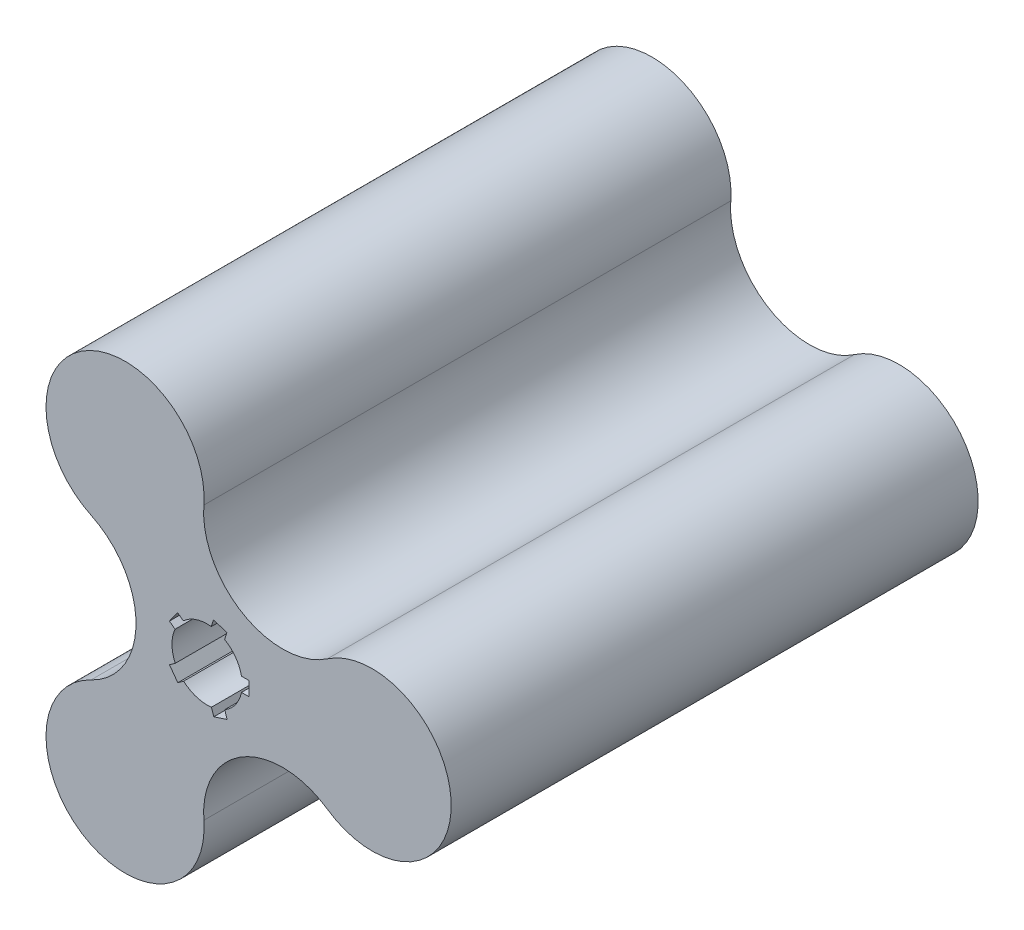
ISO-10303-21;
HEADER;
FILE_DESCRIPTION(('STEP AP214'),'2;1');
FILE_NAME('part.step','',(''),(''),'','','');
FILE_SCHEMA(('AUTOMOTIVE_DESIGN { 1 0 10303 214 1 1 1 1 }'));
ENDSEC;
DATA;
#1=APPLICATION_CONTEXT('core data for automotive mechanical design processes');
#2=APPLICATION_PROTOCOL_DEFINITION('international standard','automotive_design',2000,#1);
#3=PRODUCT_CONTEXT('',#1,'mechanical');
#4=PRODUCT('Part','Part','',(#3));
#5=PRODUCT_RELATED_PRODUCT_CATEGORY('part','',(#4));
#6=PRODUCT_DEFINITION_FORMATION('','',#4);
#7=PRODUCT_DEFINITION_CONTEXT('part definition',#1,'design');
#8=PRODUCT_DEFINITION('design','',#6,#7);
#9=PRODUCT_DEFINITION_SHAPE('','',#8);
#10=(LENGTH_UNIT() NAMED_UNIT(*) SI_UNIT(.MILLI.,.METRE.));
#11=(NAMED_UNIT(*) PLANE_ANGLE_UNIT() SI_UNIT($,.RADIAN.));
#12=(NAMED_UNIT(*) SI_UNIT($,.STERADIAN.) SOLID_ANGLE_UNIT());
#13=UNCERTAINTY_MEASURE_WITH_UNIT(LENGTH_MEASURE(1.E-05),#10,'distance_accuracy_value','');
#14=(GEOMETRIC_REPRESENTATION_CONTEXT(3) GLOBAL_UNCERTAINTY_ASSIGNED_CONTEXT((#13)) GLOBAL_UNIT_ASSIGNED_CONTEXT((#10,
#11,#12)) REPRESENTATION_CONTEXT('',''));
#15=CARTESIAN_POINT('',(0.,0.,0.));
#16=DIRECTION('',(0.,0.,1.));
#17=DIRECTION('',(1.,0.,0.));
#18=AXIS2_PLACEMENT_3D('',#15,#16,#17);
#19=CARTESIAN_POINT('',(0.,0.,75.));
#20=DIRECTION('',(0.,0.,-1.));
#21=DIRECTION('',(-1.,0.,0.));
#22=AXIS2_PLACEMENT_3D('',#19,#20,#21);
#23=CYLINDRICAL_SURFACE('',#22,10.);
#24=CARTESIAN_POINT('',(0.,0.,-75.));
#25=DIRECTION('',(0.,0.,1.));
#26=DIRECTION('',(1.,0.,0.));
#27=AXIS2_PLACEMENT_3D('',#24,#25,#26);
#28=CIRCLE('',#27,10.);
#29=CARTESIAN_POINT('',(9.79795897113271,2.,-75.));
#30=VERTEX_POINT('',#29);
#31=CARTESIAN_POINT('',(4.99493405678501,8.66317688659127,-75.));
#32=VERTEX_POINT('',#31);
#33=EDGE_CURVE('E270',#30,#32,#28,.T.);
#34=ORIENTED_EDGE('',*,*,#33,.F.);
#35=DIRECTION('',(0.,0.,-1.));
#36=VECTOR('',#35,1.);
#37=CARTESIAN_POINT('',(9.79795897113271,2.,75.));
#38=LINE('',#37,#36);
#39=CARTESIAN_POINT('',(9.79795897113271,2.,75.));
#40=VERTEX_POINT('',#39);
#41=EDGE_CURVE('E11',#40,#30,#38,.T.);
#42=ORIENTED_EDGE('',*,*,#41,.F.);
#43=CARTESIAN_POINT('',(0.,0.,75.));
#44=DIRECTION('',(0.,0.,1.));
#45=DIRECTION('',(1.,0.,0.));
#46=AXIS2_PLACEMENT_3D('',#43,#44,#45);
#47=CIRCLE('',#46,10.);
#48=CARTESIAN_POINT('',(4.99493405678501,8.66317688659127,75.));
#49=VERTEX_POINT('',#48);
#50=EDGE_CURVE('E399',#40,#49,#47,.T.);
#51=ORIENTED_EDGE('',*,*,#50,.T.);
#52=DIRECTION('',(0.,0.,-1.));
#53=VECTOR('',#52,1.);
#54=CARTESIAN_POINT('',(4.99493405678501,8.66317688659127,75.));
#55=LINE('',#54,#53);
#56=EDGE_CURVE('E62',#49,#32,#55,.T.);
#57=ORIENTED_EDGE('',*,*,#56,.T.);
#58=EDGE_LOOP('',(#34,#42,#51,#57));
#59=FACE_BOUND('',#58,.T.);
#60=ADVANCED_FACE('F43',(#59),#23,.F.);
#61=CARTESIAN_POINT('',(0.,2.,75.));
#62=DIRECTION('',(0.,1.,0.));
#63=DIRECTION('',(0.,0.,1.));
#64=AXIS2_PLACEMENT_3D('',#61,#62,#63);
#65=PLANE('',#64);
#66=DIRECTION('',(1.,0.,0.));
#67=VECTOR('',#66,1.);
#68=CARTESIAN_POINT('',(0.,2.,-75.));
#69=LINE('',#68,#67);
#70=CARTESIAN_POINT('',(12.,2.,-75.));
#71=VERTEX_POINT('',#70);
#72=EDGE_CURVE('E272',#30,#71,#69,.T.);
#73=ORIENTED_EDGE('',*,*,#72,.T.);
#74=DIRECTION('',(0.,0.,-1.));
#75=VECTOR('',#74,1.);
#76=CARTESIAN_POINT('',(12.,2.,75.));
#77=LINE('',#76,#75);
#78=CARTESIAN_POINT('',(12.,2.,75.));
#79=VERTEX_POINT('',#78);
#80=EDGE_CURVE('E53',#79,#71,#77,.T.);
#81=ORIENTED_EDGE('',*,*,#80,.F.);
#82=DIRECTION('',(1.,0.,0.));
#83=VECTOR('',#82,1.);
#84=CARTESIAN_POINT('',(0.,2.,75.));
#85=LINE('',#84,#83);
#86=EDGE_CURVE('E401',#40,#79,#85,.T.);
#87=ORIENTED_EDGE('',*,*,#86,.F.);
#88=ORIENTED_EDGE('',*,*,#41,.T.);
#89=EDGE_LOOP('',(#73,#81,#87,#88));
#90=FACE_BOUND('',#89,.T.);
#91=ADVANCED_FACE('F509',(#90),#65,.F.);
#92=CARTESIAN_POINT('',(12.,0.,75.));
#93=DIRECTION('',(-1.,0.,0.));
#94=DIRECTION('',(0.,0.,1.));
#95=AXIS2_PLACEMENT_3D('',#92,#93,#94);
#96=PLANE('',#95);
#97=DIRECTION('',(0.,1.,0.));
#98=VECTOR('',#97,1.);
#99=CARTESIAN_POINT('',(12.,0.,-75.));
#100=LINE('',#99,#98);
#101=CARTESIAN_POINT('',(12.,-2.,-75.));
#102=VERTEX_POINT('',#101);
#103=EDGE_CURVE('E277',#102,#71,#100,.T.);
#104=ORIENTED_EDGE('',*,*,#103,.F.);
#105=DIRECTION('',(0.,0.,-1.));
#106=VECTOR('',#105,1.);
#107=CARTESIAN_POINT('',(12.,-2.,75.));
#108=LINE('',#107,#106);
#109=CARTESIAN_POINT('',(12.,-2.,75.));
#110=VERTEX_POINT('',#109);
#111=EDGE_CURVE('E348',#110,#102,#108,.T.);
#112=ORIENTED_EDGE('',*,*,#111,.F.);
#113=DIRECTION('',(0.,1.,0.));
#114=VECTOR('',#113,1.);
#115=CARTESIAN_POINT('',(12.,0.,75.));
#116=LINE('',#115,#114);
#117=EDGE_CURVE('E404',#110,#79,#116,.T.);
#118=ORIENTED_EDGE('',*,*,#117,.T.);
#119=ORIENTED_EDGE('',*,*,#80,.T.);
#120=EDGE_LOOP('',(#104,#112,#118,#119));
#121=FACE_BOUND('',#120,.T.);
#122=ADVANCED_FACE('F513',(#121),#96,.T.);
#123=CARTESIAN_POINT('',(0.,-2.,75.));
#124=DIRECTION('',(0.,1.,0.));
#125=DIRECTION('',(0.,0.,1.));
#126=AXIS2_PLACEMENT_3D('',#123,#124,#125);
#127=PLANE('',#126);
#128=DIRECTION('',(1.,0.,0.));
#129=VECTOR('',#128,1.);
#130=CARTESIAN_POINT('',(0.,-2.,-75.));
#131=LINE('',#130,#129);
#132=CARTESIAN_POINT('',(9.79795897113271,-2.,-75.));
#133=VERTEX_POINT('',#132);
#134=EDGE_CURVE('E280',#133,#102,#131,.T.);
#135=ORIENTED_EDGE('',*,*,#134,.F.);
#136=DIRECTION('',(0.,0.,-1.));
#137=VECTOR('',#136,1.);
#138=CARTESIAN_POINT('',(9.79795897113271,-2.,75.));
#139=LINE('',#138,#137);
#140=CARTESIAN_POINT('',(9.79795897113271,-2.,75.));
#141=VERTEX_POINT('',#140);
#142=EDGE_CURVE('E346',#141,#133,#139,.T.);
#143=ORIENTED_EDGE('',*,*,#142,.F.);
#144=DIRECTION('',(1.,0.,0.));
#145=VECTOR('',#144,1.);
#146=CARTESIAN_POINT('',(0.,-2.,75.));
#147=LINE('',#146,#145);
#148=EDGE_CURVE('E407',#141,#110,#147,.T.);
#149=ORIENTED_EDGE('',*,*,#148,.T.);
#150=ORIENTED_EDGE('',*,*,#111,.T.);
#151=EDGE_LOOP('',(#135,#143,#149,#150));
#152=FACE_BOUND('',#151,.T.);
#153=ADVANCED_FACE('F454',(#152),#127,.T.);
#154=CARTESIAN_POINT('',(5.0350700669273,-8.63991142438004,-75.));
#155=VERTEX_POINT('',#154);
#156=EDGE_CURVE('E274',#155,#133,#28,.T.);
#157=ORIENTED_EDGE('',*,*,#156,.F.);
#158=DIRECTION('',(0.,0.,-1.));
#159=VECTOR('',#158,1.);
#160=CARTESIAN_POINT('',(5.0350700669273,-8.63991142438004,75.));
#161=LINE('',#160,#159);
#162=CARTESIAN_POINT('',(5.0350700669273,-8.63991142438004,75.));
#163=VERTEX_POINT('',#162);
#164=EDGE_CURVE('E344',#163,#155,#161,.T.);
#165=ORIENTED_EDGE('',*,*,#164,.F.);
#166=EDGE_CURVE('E402',#163,#141,#47,.T.);
#167=ORIENTED_EDGE('',*,*,#166,.T.);
#168=ORIENTED_EDGE('',*,*,#142,.T.);
#169=EDGE_LOOP('',(#157,#165,#167,#168));
#170=FACE_BOUND('',#169,.T.);
#171=ADVANCED_FACE('F446',(#170),#23,.F.);
#172=CARTESIAN_POINT('',(2.01505740128812,0.654731838718406,75.));
#173=DIRECTION('',(0.951056516295153,0.309016994374948,0.));
#174=DIRECTION('',(-0.309016994374948,0.951056516295154,0.));
#175=AXIS2_PLACEMENT_3D('',#172,#173,#174);
#176=PLANE('',#175);
#177=DIRECTION('',(0.309016994374948,-0.951056516295154,0.));
#178=VECTOR('',#177,1.);
#179=CARTESIAN_POINT('',(2.01505740128812,0.654731838718406,-75.));
#180=LINE('',#179,#178);
#181=CARTESIAN_POINT('',(5.71133747952332,-10.7212485068549,-75.));
#182=VERTEX_POINT('',#181);
#183=EDGE_CURVE('E283',#155,#182,#180,.T.);
#184=ORIENTED_EDGE('',*,*,#183,.T.);
#185=DIRECTION('',(0.,0.,-1.));
#186=VECTOR('',#185,1.);
#187=CARTESIAN_POINT('',(5.71133747952332,-10.7212485068549,75.));
#188=LINE('',#187,#186);
#189=CARTESIAN_POINT('',(5.71133747952332,-10.7212485068549,75.));
#190=VERTEX_POINT('',#189);
#191=EDGE_CURVE('E342',#190,#182,#188,.T.);
#192=ORIENTED_EDGE('',*,*,#191,.F.);
#193=DIRECTION('',(0.309016994374948,-0.951056516295154,0.));
#194=VECTOR('',#193,1.);
#195=CARTESIAN_POINT('',(2.01505740128812,0.654731838718406,75.));
#196=LINE('',#195,#194);
#197=EDGE_CURVE('E410',#163,#190,#196,.T.);
#198=ORIENTED_EDGE('',*,*,#197,.F.);
#199=ORIENTED_EDGE('',*,*,#164,.T.);
#200=EDGE_LOOP('',(#184,#192,#198,#199));
#201=FACE_BOUND('',#200,.T.);
#202=ADVANCED_FACE('F498',(#201),#176,.F.);
#203=CARTESIAN_POINT('',(3.6962800782352,-11.3759803455733,75.));
#204=DIRECTION('',(-0.309016994374947,0.951056516295154,0.));
#205=DIRECTION('',(-0.951056516295154,-0.309016994374947,0.));
#206=AXIS2_PLACEMENT_3D('',#203,#204,#205);
#207=PLANE('',#206);
#208=DIRECTION('',(0.951056516295154,0.309016994374948,0.));
#209=VECTOR('',#208,1.);
#210=CARTESIAN_POINT('',(3.6962800782352,-11.3759803455733,-75.));
#211=LINE('',#210,#209);
#212=CARTESIAN_POINT('',(1.90711141434271,-11.9573164843547,-75.));
#213=VERTEX_POINT('',#212);
#214=EDGE_CURVE('E286',#213,#182,#211,.T.);
#215=ORIENTED_EDGE('',*,*,#214,.F.);
#216=DIRECTION('',(0.,0.,-1.));
#217=VECTOR('',#216,1.);
#218=CARTESIAN_POINT('',(1.90711141434271,-11.9573164843547,75.));
#219=LINE('',#218,#217);
#220=CARTESIAN_POINT('',(1.90711141434271,-11.9573164843547,75.));
#221=VERTEX_POINT('',#220);
#222=EDGE_CURVE('E340',#221,#213,#219,.T.);
#223=ORIENTED_EDGE('',*,*,#222,.F.);
#224=DIRECTION('',(0.951056516295154,0.309016994374948,0.));
#225=VECTOR('',#224,1.);
#226=CARTESIAN_POINT('',(3.6962800782352,-11.3759803455733,75.));
#227=LINE('',#226,#225);
#228=EDGE_CURVE('E412',#221,#190,#227,.T.);
#229=ORIENTED_EDGE('',*,*,#228,.T.);
#230=ORIENTED_EDGE('',*,*,#191,.T.);
#231=EDGE_LOOP('',(#215,#223,#229,#230));
#232=FACE_BOUND('',#231,.T.);
#233=ADVANCED_FACE('F496',(#232),#207,.T.);
#234=CARTESIAN_POINT('',(-1.78916866389251,-0.581336138781391,75.));
#235=DIRECTION('',(0.951056516295153,0.309016994374949,0.));
#236=DIRECTION('',(-0.309016994374949,0.951056516295153,0.));
#237=AXIS2_PLACEMENT_3D('',#234,#235,#236);
#238=PLANE('',#237);
#239=DIRECTION('',(0.309016994374949,-0.951056516295153,0.));
#240=VECTOR('',#239,1.);
#241=CARTESIAN_POINT('',(-1.78916866389251,-0.581336138781391,-75.));
#242=LINE('',#241,#240);
#243=CARTESIAN_POINT('',(1.24582698272701,-9.92209227578082,-75.));
#244=VERTEX_POINT('',#243);
#245=EDGE_CURVE('E289',#244,#213,#242,.T.);
#246=ORIENTED_EDGE('',*,*,#245,.F.);
#247=DIRECTION('',(0.,0.,-1.));
#248=VECTOR('',#247,1.);
#249=CARTESIAN_POINT('',(1.24582698272701,-9.92209227578082,75.));
#250=LINE('',#249,#248);
#251=CARTESIAN_POINT('',(1.24582698272701,-9.92209227578082,75.));
#252=VERTEX_POINT('',#251);
#253=EDGE_CURVE('E338',#252,#244,#250,.T.);
#254=ORIENTED_EDGE('',*,*,#253,.F.);
#255=DIRECTION('',(0.309016994374949,-0.951056516295153,0.));
#256=VECTOR('',#255,1.);
#257=CARTESIAN_POINT('',(-1.78916866389251,-0.581336138781391,75.));
#258=LINE('',#257,#256);
#259=EDGE_CURVE('E415',#252,#221,#258,.T.);
#260=ORIENTED_EDGE('',*,*,#259,.T.);
#261=ORIENTED_EDGE('',*,*,#222,.T.);
#262=EDGE_LOOP('',(#246,#254,#260,#261));
#263=FACE_BOUND('',#262,.T.);
#264=ADVANCED_FACE('F493',(#263),#238,.T.);
#265=CARTESIAN_POINT('',(-6.66112184182044,-7.45851565718157,-75.));
#266=VERTEX_POINT('',#265);
#267=EDGE_CURVE('E292',#266,#244,#28,.T.);
#268=ORIENTED_EDGE('',*,*,#267,.F.);
#269=DIRECTION('',(0.,0.,-1.));
#270=VECTOR('',#269,1.);
#271=CARTESIAN_POINT('',(-6.66112184182044,-7.45851565718157,75.));
#272=LINE('',#271,#270);
#273=CARTESIAN_POINT('',(-6.66112184182044,-7.45851565718157,75.));
#274=VERTEX_POINT('',#273);
#275=EDGE_CURVE('E336',#274,#266,#272,.T.);
#276=ORIENTED_EDGE('',*,*,#275,.F.);
#277=EDGE_CURVE('E418',#274,#252,#47,.T.);
#278=ORIENTED_EDGE('',*,*,#277,.T.);
#279=ORIENTED_EDGE('',*,*,#253,.T.);
#280=EDGE_LOOP('',(#268,#276,#278,#279));
#281=FACE_BOUND('',#280,.T.);
#282=ADVANCED_FACE('F489',(#281),#23,.F.);
#283=CARTESIAN_POINT('',(1.24537396327809,-1.7141102072815,75.));
#284=DIRECTION('',(0.587785252292473,-0.809016994374948,0.));
#285=DIRECTION('',(0.809016994374948,0.587785252292473,0.));
#286=AXIS2_PLACEMENT_3D('',#283,#284,#285);
#287=PLANE('',#286);
#288=DIRECTION('',(-0.809016994374948,-0.587785252292473,0.));
#289=VECTOR('',#288,1.);
#290=CARTESIAN_POINT('',(1.24537396327809,-1.7141102072815,-75.));
#291=LINE('',#290,#289);
#292=CARTESIAN_POINT('',(-8.33059239904714,-8.67145701625957,-75.));
#293=VERTEX_POINT('',#292);
#294=EDGE_CURVE('E293',#266,#293,#291,.T.);
#295=ORIENTED_EDGE('',*,*,#294,.T.);
#296=DIRECTION('',(0.,0.,-1.));
#297=VECTOR('',#296,1.);
#298=CARTESIAN_POINT('',(-8.33059239904714,-8.67145701625957,75.));
#299=LINE('',#298,#297);
#300=CARTESIAN_POINT('',(-8.33059239904714,-8.67145701625957,75.));
#301=VERTEX_POINT('',#300);
#302=EDGE_CURVE('E334',#301,#293,#299,.T.);
#303=ORIENTED_EDGE('',*,*,#302,.F.);
#304=DIRECTION('',(-0.809016994374948,-0.587785252292473,0.));
#305=VECTOR('',#304,1.);
#306=CARTESIAN_POINT('',(1.24537396327809,-1.7141102072815,75.));
#307=LINE('',#306,#305);
#308=EDGE_CURVE('E419',#274,#301,#307,.T.);
#309=ORIENTED_EDGE('',*,*,#308,.F.);
#310=ORIENTED_EDGE('',*,*,#275,.T.);
#311=EDGE_LOOP('',(#295,#303,#309,#310));
#312=FACE_BOUND('',#311,.T.);
#313=ADVANCED_FACE('F488',(#312),#287,.F.);
#314=CARTESIAN_POINT('',(-9.57596636232523,-6.95734680897807,75.));
#315=DIRECTION('',(0.809016994374947,0.587785252292473,0.));
#316=DIRECTION('',(-0.587785252292473,0.809016994374947,0.));
#317=AXIS2_PLACEMENT_3D('',#314,#315,#316);
#318=PLANE('',#317);
#319=DIRECTION('',(0.587785252292473,-0.809016994374947,0.));
#320=VECTOR('',#319,1.);
#321=CARTESIAN_POINT('',(-9.57596636232523,-6.95734680897807,-75.));
#322=LINE('',#321,#320);
#323=CARTESIAN_POINT('',(-10.681733408217,-5.43538903875978,-75.));
#324=VERTEX_POINT('',#323);
#325=EDGE_CURVE('E296',#324,#293,#322,.T.);
#326=ORIENTED_EDGE('',*,*,#325,.F.);
#327=DIRECTION('',(0.,0.,-1.));
#328=VECTOR('',#327,1.);
#329=CARTESIAN_POINT('',(-10.681733408217,-5.43538903875978,75.));
#330=LINE('',#329,#328);
#331=CARTESIAN_POINT('',(-10.681733408217,-5.43538903875978,75.));
#332=VERTEX_POINT('',#331);
#333=EDGE_CURVE('E332',#332,#324,#330,.T.);
#334=ORIENTED_EDGE('',*,*,#333,.F.);
#335=DIRECTION('',(0.587785252292473,-0.809016994374947,0.));
#336=VECTOR('',#335,1.);
#337=CARTESIAN_POINT('',(-9.57596636232523,-6.95734680897807,75.));
#338=LINE('',#337,#336);
#339=EDGE_CURVE('E421',#332,#301,#338,.T.);
#340=ORIENTED_EDGE('',*,*,#339,.T.);
#341=ORIENTED_EDGE('',*,*,#302,.T.);
#342=EDGE_LOOP('',(#326,#334,#340,#341));
#343=FACE_BOUND('',#342,.T.);
#344=ADVANCED_FACE('F483',(#343),#318,.T.);
#345=CARTESIAN_POINT('',(-1.10576704589181,1.5219577702183,75.));
#346=DIRECTION('',(0.587785252292474,-0.809016994374947,0.));
#347=DIRECTION('',(0.809016994374947,0.587785252292474,0.));
#348=AXIS2_PLACEMENT_3D('',#345,#346,#347);
#349=PLANE('',#348);
#350=DIRECTION('',(-0.809016994374947,-0.587785252292474,0.));
#351=VECTOR('',#350,1.);
#352=CARTESIAN_POINT('',(-1.10576704589181,1.5219577702183,-75.));
#353=LINE('',#352,#351);
#354=CARTESIAN_POINT('',(-9.05148880444964,-4.25094700307152,-75.));
#355=VERTEX_POINT('',#354);
#356=EDGE_CURVE('E299',#355,#324,#353,.T.);
#357=ORIENTED_EDGE('',*,*,#356,.F.);
#358=DIRECTION('',(0.,0.,-1.));
#359=VECTOR('',#358,1.);
#360=CARTESIAN_POINT('',(-9.05148880444964,-4.25094700307152,75.));
#361=LINE('',#360,#359);
#362=CARTESIAN_POINT('',(-9.05148880444964,-4.25094700307152,75.));
#363=VERTEX_POINT('',#362);
#364=EDGE_CURVE('E330',#363,#355,#361,.T.);
#365=ORIENTED_EDGE('',*,*,#364,.F.);
#366=DIRECTION('',(-0.809016994374947,-0.587785252292474,0.));
#367=VECTOR('',#366,1.);
#368=CARTESIAN_POINT('',(-1.10576704589181,1.5219577702183,75.));
#369=LINE('',#368,#367);
#370=EDGE_CURVE('E424',#363,#332,#369,.T.);
#371=ORIENTED_EDGE('',*,*,#370,.T.);
#372=ORIENTED_EDGE('',*,*,#333,.T.);
#373=EDGE_LOOP('',(#357,#365,#371,#372));
#374=FACE_BOUND('',#373,.T.);
#375=ADVANCED_FACE('F480',(#374),#349,.T.);
#376=CARTESIAN_POINT('',(-9.10228582241979,4.14106179704865,-75.));
#377=VERTEX_POINT('',#376);
#378=EDGE_CURVE('E302',#377,#355,#28,.T.);
#379=ORIENTED_EDGE('',*,*,#378,.F.);
#380=DIRECTION('',(0.,0.,-1.));
#381=VECTOR('',#380,1.);
#382=CARTESIAN_POINT('',(-9.10228582241979,4.14106179704865,75.));
#383=LINE('',#382,#381);
#384=CARTESIAN_POINT('',(-9.10228582241979,4.14106179704865,75.));
#385=VERTEX_POINT('',#384);
#386=EDGE_CURVE('E328',#385,#377,#383,.T.);
#387=ORIENTED_EDGE('',*,*,#386,.F.);
#388=EDGE_CURVE('E427',#385,#363,#47,.T.);
#389=ORIENTED_EDGE('',*,*,#388,.T.);
#390=ORIENTED_EDGE('',*,*,#364,.T.);
#391=EDGE_LOOP('',(#379,#387,#389,#390));
#392=FACE_BOUND('',#391,.T.);
#393=ADVANCED_FACE('F475',(#392),#23,.F.);
#394=CARTESIAN_POINT('',(-1.17557050458495,-1.61803398874989,75.));
#395=DIRECTION('',(-0.587785252292473,-0.809016994374947,0.));
#396=DIRECTION('',(0.809016994374947,-0.587785252292473,0.));
#397=AXIS2_PLACEMENT_3D('',#394,#395,#396);
#398=PLANE('',#397);
#399=DIRECTION('',(-0.809016994374947,0.587785252292473,0.));
#400=VECTOR('',#399,1.);
#401=CARTESIAN_POINT('',(-1.17557050458495,-1.61803398874989,-75.));
#402=LINE('',#401,#400);
#403=CARTESIAN_POINT('',(-10.7203198111697,5.31663230163359,-75.));
#404=VERTEX_POINT('',#403);
#405=EDGE_CURVE('E303',#377,#404,#402,.T.);
#406=ORIENTED_EDGE('',*,*,#405,.T.);
#407=DIRECTION('',(0.,0.,-1.));
#408=VECTOR('',#407,1.);
#409=CARTESIAN_POINT('',(-10.7203198111697,5.31663230163359,75.));
#410=LINE('',#409,#408);
#411=CARTESIAN_POINT('',(-10.7203198111697,5.31663230163359,75.));
#412=VERTEX_POINT('',#411);
#413=EDGE_CURVE('E326',#412,#404,#410,.T.);
#414=ORIENTED_EDGE('',*,*,#413,.F.);
#415=DIRECTION('',(-0.809016994374947,0.587785252292473,0.));
#416=VECTOR('',#415,1.);
#417=CARTESIAN_POINT('',(-1.17557050458495,-1.61803398874989,75.));
#418=LINE('',#417,#416);
#419=EDGE_CURVE('E428',#385,#412,#418,.T.);
#420=ORIENTED_EDGE('',*,*,#419,.F.);
#421=ORIENTED_EDGE('',*,*,#386,.T.);
#422=EDGE_LOOP('',(#406,#414,#420,#421));
#423=FACE_BOUND('',#422,.T.);
#424=ADVANCED_FACE('F524',(#423),#398,.F.);
#425=CARTESIAN_POINT('',(-9.54474930658473,6.93466629038348,75.));
#426=DIRECTION('',(0.809016994374948,-0.587785252292473,0.));
#427=DIRECTION('',(0.587785252292473,0.809016994374948,0.));
#428=AXIS2_PLACEMENT_3D('',#425,#426,#427);
#429=PLANE('',#428);
#430=DIRECTION('',(-0.587785252292473,-0.809016994374948,0.));
#431=VECTOR('',#430,1.);
#432=CARTESIAN_POINT('',(-9.54474930658473,6.93466629038348,-75.));
#433=LINE('',#432,#431);
#434=CARTESIAN_POINT('',(-8.36917880199978,8.55270027913339,-75.));
#435=VERTEX_POINT('',#434);
#436=EDGE_CURVE('E306',#435,#404,#433,.T.);
#437=ORIENTED_EDGE('',*,*,#436,.F.);
#438=DIRECTION('',(0.,0.,-1.));
#439=VECTOR('',#438,1.);
#440=CARTESIAN_POINT('',(-8.36917880199978,8.55270027913339,75.));
#441=LINE('',#440,#439);
#442=CARTESIAN_POINT('',(-8.36917880199978,8.55270027913339,75.));
#443=VERTEX_POINT('',#442);
#444=EDGE_CURVE('E324',#443,#435,#441,.T.);
#445=ORIENTED_EDGE('',*,*,#444,.F.);
#446=DIRECTION('',(-0.587785252292473,-0.809016994374948,0.));
#447=VECTOR('',#446,1.);
#448=CARTESIAN_POINT('',(-9.54474930658473,6.93466629038348,75.));
#449=LINE('',#448,#447);
#450=EDGE_CURVE('E430',#443,#412,#449,.T.);
#451=ORIENTED_EDGE('',*,*,#450,.T.);
#452=ORIENTED_EDGE('',*,*,#413,.T.);
#453=EDGE_LOOP('',(#437,#445,#451,#452));
#454=FACE_BOUND('',#453,.T.);
#455=ADVANCED_FACE('F472',(#454),#429,.T.);
#456=CARTESIAN_POINT('',(1.17557050458495,1.6180339887499,75.));
#457=DIRECTION('',(-0.587785252292473,-0.809016994374947,0.));
#458=DIRECTION('',(0.809016994374947,-0.587785252292473,0.));
#459=AXIS2_PLACEMENT_3D('',#456,#457,#458);
#460=PLANE('',#459);
#461=DIRECTION('',(-0.809016994374947,0.587785252292473,0.));
#462=VECTOR('',#461,1.);
#463=CARTESIAN_POINT('',(1.17557050458495,1.6180339887499,-75.));
#464=LINE('',#463,#462);
#465=CARTESIAN_POINT('',(-6.75114481324989,7.37712977454845,-75.));
#466=VERTEX_POINT('',#465);
#467=EDGE_CURVE('E309',#466,#435,#464,.T.);
#468=ORIENTED_EDGE('',*,*,#467,.F.);
#469=DIRECTION('',(0.,0.,-1.));
#470=VECTOR('',#469,1.);
#471=CARTESIAN_POINT('',(-6.75114481324989,7.37712977454845,75.));
#472=LINE('',#471,#470);
#473=CARTESIAN_POINT('',(-6.75114481324989,7.37712977454845,75.));
#474=VERTEX_POINT('',#473);
#475=EDGE_CURVE('E322',#474,#466,#472,.T.);
#476=ORIENTED_EDGE('',*,*,#475,.F.);
#477=DIRECTION('',(-0.809016994374947,0.587785252292473,0.));
#478=VECTOR('',#477,1.);
#479=CARTESIAN_POINT('',(1.17557050458495,1.6180339887499,75.));
#480=LINE('',#479,#478);
#481=EDGE_CURVE('E432',#474,#443,#480,.T.);
#482=ORIENTED_EDGE('',*,*,#481,.T.);
#483=ORIENTED_EDGE('',*,*,#444,.T.);
#484=EDGE_LOOP('',(#468,#476,#482,#483));
#485=FACE_BOUND('',#484,.T.);
#486=ADVANCED_FACE('F468',(#485),#460,.T.);
#487=CARTESIAN_POINT('',(1.19996754517139,9.92774283966579,-75.));
#488=VERTEX_POINT('',#487);
#489=EDGE_CURVE('E273',#488,#466,#28,.T.);
#490=ORIENTED_EDGE('',*,*,#489,.F.);
#491=DIRECTION('',(0.,0.,-1.));
#492=VECTOR('',#491,1.);
#493=CARTESIAN_POINT('',(1.19996754517139,9.92774283966579,75.));
#494=LINE('',#493,#492);
#495=CARTESIAN_POINT('',(1.19996754517139,9.92774283966579,75.));
#496=VERTEX_POINT('',#495);
#497=EDGE_CURVE('E243',#496,#488,#494,.T.);
#498=ORIENTED_EDGE('',*,*,#497,.F.);
#499=EDGE_CURVE('E233',#496,#474,#47,.T.);
#500=ORIENTED_EDGE('',*,*,#499,.T.);
#501=ORIENTED_EDGE('',*,*,#475,.T.);
#502=EDGE_LOOP('',(#490,#498,#500,#501));
#503=FACE_BOUND('',#502,.T.);
#504=ADVANCED_FACE('F467',(#503),#23,.F.);
#505=CARTESIAN_POINT('',(-1.83230957389716,0.59535347015531,75.));
#506=DIRECTION('',(-0.951056516295154,0.309016994374947,0.));
#507=DIRECTION('',(-0.309016994374947,-0.951056516295154,0.));
#508=AXIS2_PLACEMENT_3D('',#505,#506,#507);
#509=PLANE('',#508);
#510=DIRECTION('',(0.309016994374947,0.951056516295154,0.));
#511=VECTOR('',#510,1.);
#512=CARTESIAN_POINT('',(-1.83230957389716,0.59535347015531,-75.));
#513=LINE('',#512,#511);
#514=CARTESIAN_POINT('',(1.84467730286171,11.9119554471655,-75.));
#515=VERTEX_POINT('',#514);
#516=EDGE_CURVE('E240',#488,#515,#513,.T.);
#517=ORIENTED_EDGE('',*,*,#516,.T.);
#518=DIRECTION('',(0.,0.,-1.));
#519=VECTOR('',#518,1.);
#520=CARTESIAN_POINT('',(1.84467730286171,11.9119554471655,75.));
#521=LINE('',#520,#519);
#522=CARTESIAN_POINT('',(1.84467730286171,11.9119554471655,75.));
#523=VERTEX_POINT('',#522);
#524=EDGE_CURVE('E237',#523,#515,#521,.T.);
#525=ORIENTED_EDGE('',*,*,#524,.F.);
#526=DIRECTION('',(0.309016994374947,0.951056516295154,0.));
#527=VECTOR('',#526,1.);
#528=CARTESIAN_POINT('',(-1.83230957389716,0.59535347015531,75.));
#529=LINE('',#528,#527);
#530=EDGE_CURVE('E224',#496,#523,#529,.T.);
#531=ORIENTED_EDGE('',*,*,#530,.F.);
#532=ORIENTED_EDGE('',*,*,#497,.T.);
#533=EDGE_LOOP('',(#517,#525,#531,#532));
#534=FACE_BOUND('',#533,.T.);
#535=ADVANCED_FACE('F238',(#534),#509,.F.);
#536=CARTESIAN_POINT('',(3.67698687675887,11.3166019770102,75.));
#537=DIRECTION('',(-0.309016994374947,-0.951056516295154,0.));
#538=DIRECTION('',(0.951056516295154,-0.309016994374947,0.));
#539=AXIS2_PLACEMENT_3D('',#536,#537,#538);
#540=PLANE('',#539);
#541=DIRECTION('',(-0.951056516295154,0.309016994374948,0.));
#542=VECTOR('',#541,1.);
#543=CARTESIAN_POINT('',(3.67698687675887,11.3166019770102,-75.));
#544=LINE('',#543,#542);
#545=CARTESIAN_POINT('',(5.64890336804233,10.6758874696658,-75.));
#546=VERTEX_POINT('',#545);
#547=EDGE_CURVE('E313',#546,#515,#544,.T.);
#548=ORIENTED_EDGE('',*,*,#547,.F.);
#549=DIRECTION('',(0.,0.,-1.));
#550=VECTOR('',#549,1.);
#551=CARTESIAN_POINT('',(5.64890336804233,10.6758874696658,75.));
#552=LINE('',#551,#550);
#553=CARTESIAN_POINT('',(5.64890336804233,10.6758874696658,75.));
#554=VERTEX_POINT('',#553);
#555=EDGE_CURVE('E141',#554,#546,#552,.T.);
#556=ORIENTED_EDGE('',*,*,#555,.F.);
#557=DIRECTION('',(-0.951056516295154,0.309016994374948,0.));
#558=VECTOR('',#557,1.);
#559=CARTESIAN_POINT('',(3.67698687675887,11.3166019770102,75.));
#560=LINE('',#559,#558);
#561=EDGE_CURVE('E230',#554,#523,#560,.T.);
#562=ORIENTED_EDGE('',*,*,#561,.T.);
#563=ORIENTED_EDGE('',*,*,#524,.T.);
#564=EDGE_LOOP('',(#548,#556,#562,#563));
#565=FACE_BOUND('',#564,.T.);
#566=ADVANCED_FACE('F245',(#565),#540,.T.);
#567=CARTESIAN_POINT('',(-42.7228047434548,-0.0328235548630718,75.));
#568=DIRECTION('',(0.,0.,-1.));
#569=DIRECTION('',(-1.,0.,0.));
#570=AXIS2_PLACEMENT_3D('',#567,#568,#569);
#571=CYLINDRICAL_SURFACE('',#570,22.5);
#572=CARTESIAN_POINT('',(-42.7228047434548,-0.0328235548630718,-75.));
#573=DIRECTION('',(0.,0.,1.));
#574=DIRECTION('',(1.,0.,0.));
#575=AXIS2_PLACEMENT_3D('',#572,#573,#574);
#576=CIRCLE('',#575,22.5);
#577=CARTESIAN_POINT('',(-33.0356341205142,-20.3406724148983,-75.));
#578=VERTEX_POINT('',#577);
#579=CARTESIAN_POINT('',(-33.0356341205142,20.2750253051722,-75.));
#580=VERTEX_POINT('',#579);
#581=EDGE_CURVE('E252',#578,#580,#576,.T.);
#582=ORIENTED_EDGE('',*,*,#581,.F.);
#583=DIRECTION('',(0.,0.,-1.));
#584=VECTOR('',#583,1.);
#585=CARTESIAN_POINT('',(-33.0356341205142,-20.3406724148983,75.));
#586=LINE('',#585,#584);
#587=CARTESIAN_POINT('',(-33.0356341205142,-20.3406724148983,75.));
#588=VERTEX_POINT('',#587);
#589=EDGE_CURVE('E47',#588,#578,#586,.T.);
#590=ORIENTED_EDGE('',*,*,#589,.F.);
#591=CARTESIAN_POINT('',(-42.7228047434548,-0.0328235548630718,75.));
#592=DIRECTION('',(0.,0.,1.));
#593=DIRECTION('',(1.,0.,0.));
#594=AXIS2_PLACEMENT_3D('',#591,#592,#593);
#595=CIRCLE('',#594,22.5);
#596=CARTESIAN_POINT('',(-33.0356341205142,20.2750253051722,75.));
#597=VERTEX_POINT('',#596);
#598=EDGE_CURVE('E318',#588,#597,#595,.T.);
#599=ORIENTED_EDGE('',*,*,#598,.T.);
#600=DIRECTION('',(0.,0.,-1.));
#601=VECTOR('',#600,1.);
#602=CARTESIAN_POINT('',(-33.0356341205142,20.2750253051722,75.));
#603=LINE('',#602,#601);
#604=EDGE_CURVE('E248',#597,#580,#603,.T.);
#605=ORIENTED_EDGE('',*,*,#604,.T.);
#606=EDGE_LOOP('',(#582,#590,#599,#605));
#607=FACE_BOUND('',#606,.T.);
#608=ADVANCED_FACE('F45',(#607),#571,.F.);
#609=CARTESIAN_POINT('',(-23.3484634975735,-40.6485212749336,75.));
#610=DIRECTION('',(0.,0.,-1.));
#611=DIRECTION('',(-1.,0.,0.));
#612=AXIS2_PLACEMENT_3D('',#609,#610,#611);
#613=CYLINDRICAL_SURFACE('',#612,22.5);
#614=CARTESIAN_POINT('',(-23.3484634975735,-40.6485212749336,-75.));
#615=DIRECTION('',(0.,0.,1.));
#616=DIRECTION('',(1.,0.,0.));
#617=AXIS2_PLACEMENT_3D('',#614,#615,#616);
#618=CIRCLE('',#617,22.5);
#619=CARTESIAN_POINT('',(-0.917765177097844,-38.8839326951769,-75.));
#620=VERTEX_POINT('',#619);
#621=EDGE_CURVE('E255',#578,#620,#618,.T.);
#622=ORIENTED_EDGE('',*,*,#621,.T.);
#623=DIRECTION('',(0.,0.,-1.));
#624=VECTOR('',#623,1.);
#625=CARTESIAN_POINT('',(-0.917765177097844,-38.8839326951769,75.));
#626=LINE('',#625,#624);
#627=CARTESIAN_POINT('',(-0.917765177097844,-38.8839326951769,75.));
#628=VERTEX_POINT('',#627);
#629=EDGE_CURVE('E357',#628,#620,#626,.T.);
#630=ORIENTED_EDGE('',*,*,#629,.F.);
#631=CARTESIAN_POINT('',(-23.3484634975735,-40.6485212749336,75.));
#632=DIRECTION('',(0.,0.,1.));
#633=DIRECTION('',(1.,0.,0.));
#634=AXIS2_PLACEMENT_3D('',#631,#632,#633);
#635=CIRCLE('',#634,22.5);
#636=EDGE_CURVE('E365',#588,#628,#635,.T.);
#637=ORIENTED_EDGE('',*,*,#636,.F.);
#638=ORIENTED_EDGE('',*,*,#589,.T.);
#639=EDGE_LOOP('',(#622,#630,#637,#638));
#640=FACE_BOUND('',#639,.T.);
#641=ADVANCED_FACE('F364',(#640),#613,.T.);
#642=CARTESIAN_POINT('',(21.5129331433779,-37.1193441154201,75.));
#643=DIRECTION('',(0.,0.,-1.));
#644=DIRECTION('',(-1.,0.,0.));
#645=AXIS2_PLACEMENT_3D('',#642,#643,#644);
#646=CYLINDRICAL_SURFACE('',#645,22.5);
#647=CARTESIAN_POINT('',(21.5129331433779,-37.1193441154201,-75.));
#648=DIRECTION('',(0.,0.,1.));
#649=DIRECTION('',(1.,0.,0.));
#650=AXIS2_PLACEMENT_3D('',#647,#648,#649);
#651=CIRCLE('',#650,22.5);
#652=CARTESIAN_POINT('',(34.2564608409129,-18.5760838351416,-75.));
#653=VERTEX_POINT('',#652);
#654=EDGE_CURVE('E258',#653,#620,#651,.T.);
#655=ORIENTED_EDGE('',*,*,#654,.F.);
#656=DIRECTION('',(0.,0.,-1.));
#657=VECTOR('',#656,1.);
#658=CARTESIAN_POINT('',(34.2564608409129,-18.5760838351416,75.));
#659=LINE('',#658,#657);
#660=CARTESIAN_POINT('',(34.2564608409129,-18.5760838351416,75.));
#661=VERTEX_POINT('',#660);
#662=EDGE_CURVE('E356',#661,#653,#659,.T.);
#663=ORIENTED_EDGE('',*,*,#662,.F.);
#664=CARTESIAN_POINT('',(21.5129331433779,-37.1193441154201,75.));
#665=DIRECTION('',(0.,0.,1.));
#666=DIRECTION('',(1.,0.,0.));
#667=AXIS2_PLACEMENT_3D('',#664,#665,#666);
#668=CIRCLE('',#667,22.5);
#669=EDGE_CURVE('E388',#661,#628,#668,.T.);
#670=ORIENTED_EDGE('',*,*,#669,.T.);
#671=ORIENTED_EDGE('',*,*,#629,.T.);
#672=EDGE_LOOP('',(#655,#663,#670,#671));
#673=FACE_BOUND('',#672,.T.);
#674=ADVANCED_FACE('F386',(#673),#646,.F.);
#675=CARTESIAN_POINT('',(46.999988538448,-0.0328235548630692,75.));
#676=DIRECTION('',(0.,0.,-1.));
#677=DIRECTION('',(-1.,0.,0.));
#678=AXIS2_PLACEMENT_3D('',#675,#676,#677);
#679=CYLINDRICAL_SURFACE('',#678,22.5);
#680=CARTESIAN_POINT('',(46.999988538448,-0.0328235548630692,-75.));
#681=DIRECTION('',(0.,0.,1.));
#682=DIRECTION('',(1.,0.,0.));
#683=AXIS2_PLACEMENT_3D('',#680,#681,#682);
#684=CIRCLE('',#683,22.5);
#685=CARTESIAN_POINT('',(34.256460840913,18.5104367254155,-75.));
#686=VERTEX_POINT('',#685);
#687=EDGE_CURVE('E261',#653,#686,#684,.T.);
#688=ORIENTED_EDGE('',*,*,#687,.T.);
#689=DIRECTION('',(0.,0.,-1.));
#690=VECTOR('',#689,1.);
#691=CARTESIAN_POINT('',(34.256460840913,18.5104367254155,75.));
#692=LINE('',#691,#690);
#693=CARTESIAN_POINT('',(34.256460840913,18.5104367254155,75.));
#694=VERTEX_POINT('',#693);
#695=EDGE_CURVE('E354',#694,#686,#692,.T.);
#696=ORIENTED_EDGE('',*,*,#695,.F.);
#697=CARTESIAN_POINT('',(46.999988538448,-0.0328235548630692,75.));
#698=DIRECTION('',(0.,0.,1.));
#699=DIRECTION('',(1.,0.,0.));
#700=AXIS2_PLACEMENT_3D('',#697,#698,#699);
#701=CIRCLE('',#700,22.5);
#702=EDGE_CURVE('E389',#661,#694,#701,.T.);
#703=ORIENTED_EDGE('',*,*,#702,.F.);
#704=ORIENTED_EDGE('',*,*,#662,.T.);
#705=EDGE_LOOP('',(#688,#696,#703,#704));
#706=FACE_BOUND('',#705,.T.);
#707=ADVANCED_FACE('F385',(#706),#679,.T.);
#708=CARTESIAN_POINT('',(21.5129331433779,37.053697005694,75.));
#709=DIRECTION('',(0.,0.,-1.));
#710=DIRECTION('',(-1.,0.,0.));
#711=AXIS2_PLACEMENT_3D('',#708,#709,#710);
#712=CYLINDRICAL_SURFACE('',#711,22.5);
#713=CARTESIAN_POINT('',(21.5129331433779,37.053697005694,-75.));
#714=DIRECTION('',(0.,0.,1.));
#715=DIRECTION('',(1.,0.,0.));
#716=AXIS2_PLACEMENT_3D('',#713,#714,#715);
#717=CIRCLE('',#716,22.5);
#718=CARTESIAN_POINT('',(-0.917765177097851,38.8182855854507,-75.));
#719=VERTEX_POINT('',#718);
#720=EDGE_CURVE('E264',#719,#686,#717,.T.);
#721=ORIENTED_EDGE('',*,*,#720,.F.);
#722=DIRECTION('',(0.,0.,-1.));
#723=VECTOR('',#722,1.);
#724=CARTESIAN_POINT('',(-0.917765177097851,38.8182855854507,75.));
#725=LINE('',#724,#723);
#726=CARTESIAN_POINT('',(-0.917765177097851,38.8182855854507,75.));
#727=VERTEX_POINT('',#726);
#728=EDGE_CURVE('E352',#727,#719,#725,.T.);
#729=ORIENTED_EDGE('',*,*,#728,.F.);
#730=CARTESIAN_POINT('',(21.5129331433779,37.053697005694,75.));
#731=DIRECTION('',(0.,0.,1.));
#732=DIRECTION('',(1.,0.,0.));
#733=AXIS2_PLACEMENT_3D('',#730,#731,#732);
#734=CIRCLE('',#733,22.5);
#735=EDGE_CURVE('E382',#727,#694,#734,.T.);
#736=ORIENTED_EDGE('',*,*,#735,.T.);
#737=ORIENTED_EDGE('',*,*,#695,.T.);
#738=EDGE_LOOP('',(#721,#729,#736,#737));
#739=FACE_BOUND('',#738,.T.);
#740=ADVANCED_FACE('F378',(#739),#712,.F.);
#741=CARTESIAN_POINT('',(-23.3484634975736,40.5828741652075,75.));
#742=DIRECTION('',(0.,0.,-1.));
#743=DIRECTION('',(-1.,0.,0.));
#744=AXIS2_PLACEMENT_3D('',#741,#742,#743);
#745=CYLINDRICAL_SURFACE('',#744,22.5);
#746=CARTESIAN_POINT('',(-23.3484634975736,40.5828741652075,-75.));
#747=DIRECTION('',(0.,0.,1.));
#748=DIRECTION('',(1.,0.,0.));
#749=AXIS2_PLACEMENT_3D('',#746,#747,#748);
#750=CIRCLE('',#749,22.5);
#751=EDGE_CURVE('E267',#719,#580,#750,.T.);
#752=ORIENTED_EDGE('',*,*,#751,.T.);
#753=ORIENTED_EDGE('',*,*,#604,.F.);
#754=CARTESIAN_POINT('',(-23.3484634975736,40.5828741652075,75.));
#755=DIRECTION('',(0.,0.,1.));
#756=DIRECTION('',(1.,0.,0.));
#757=AXIS2_PLACEMENT_3D('',#754,#755,#756);
#758=CIRCLE('',#757,22.5);
#759=EDGE_CURVE('E397',#727,#597,#758,.T.);
#760=ORIENTED_EDGE('',*,*,#759,.F.);
#761=ORIENTED_EDGE('',*,*,#728,.T.);
#762=EDGE_LOOP('',(#752,#753,#760,#761));
#763=FACE_BOUND('',#762,.T.);
#764=ADVANCED_FACE('F375',(#763),#745,.T.);
#765=CARTESIAN_POINT('',(1.97191649128347,-0.64071450734448,75.));
#766=DIRECTION('',(-0.951056516295154,0.309016994374946,0.));
#767=DIRECTION('',(-0.309016994374946,-0.951056516295154,0.));
#768=AXIS2_PLACEMENT_3D('',#765,#766,#767);
#769=PLANE('',#768);
#770=DIRECTION('',(0.309016994374946,0.951056516295154,0.));
#771=VECTOR('',#770,1.);
#772=CARTESIAN_POINT('',(1.97191649128347,-0.64071450734448,-75.));
#773=LINE('',#772,#771);
#774=EDGE_CURVE('E315',#32,#546,#773,.T.);
#775=ORIENTED_EDGE('',*,*,#774,.F.);
#776=ORIENTED_EDGE('',*,*,#56,.F.);
#777=DIRECTION('',(0.309016994374946,0.951056516295154,0.));
#778=VECTOR('',#777,1.);
#779=CARTESIAN_POINT('',(1.97191649128347,-0.64071450734448,75.));
#780=LINE('',#779,#778);
#781=EDGE_CURVE('E246',#49,#554,#780,.T.);
#782=ORIENTED_EDGE('',*,*,#781,.T.);
#783=ORIENTED_EDGE('',*,*,#555,.T.);
#784=EDGE_LOOP('',(#775,#776,#782,#783));
#785=FACE_BOUND('',#784,.T.);
#786=ADVANCED_FACE('F619',(#785),#769,.T.);
#787=CARTESIAN_POINT('',(0.,0.,75.));
#788=DIRECTION('',(0.,0.,1.));
#789=DIRECTION('',(1.,0.,0.));
#790=AXIS2_PLACEMENT_3D('',#787,#788,#789);
#791=PLANE('',#790);
#792=ORIENTED_EDGE('',*,*,#598,.F.);
#793=ORIENTED_EDGE('',*,*,#636,.T.);
#794=ORIENTED_EDGE('',*,*,#669,.F.);
#795=ORIENTED_EDGE('',*,*,#702,.T.);
#796=ORIENTED_EDGE('',*,*,#735,.F.);
#797=ORIENTED_EDGE('',*,*,#759,.T.);
#798=EDGE_LOOP('',(#792,#793,#794,#795,#796,#797));
#799=FACE_BOUND('',#798,.T.);
#800=ORIENTED_EDGE('',*,*,#50,.F.);
#801=ORIENTED_EDGE('',*,*,#86,.T.);
#802=ORIENTED_EDGE('',*,*,#117,.F.);
#803=ORIENTED_EDGE('',*,*,#148,.F.);
#804=ORIENTED_EDGE('',*,*,#166,.F.);
#805=ORIENTED_EDGE('',*,*,#197,.T.);
#806=ORIENTED_EDGE('',*,*,#228,.F.);
#807=ORIENTED_EDGE('',*,*,#259,.F.);
#808=ORIENTED_EDGE('',*,*,#277,.F.);
#809=ORIENTED_EDGE('',*,*,#308,.T.);
#810=ORIENTED_EDGE('',*,*,#339,.F.);
#811=ORIENTED_EDGE('',*,*,#370,.F.);
#812=ORIENTED_EDGE('',*,*,#388,.F.);
#813=ORIENTED_EDGE('',*,*,#419,.T.);
#814=ORIENTED_EDGE('',*,*,#450,.F.);
#815=ORIENTED_EDGE('',*,*,#481,.F.);
#816=ORIENTED_EDGE('',*,*,#499,.F.);
#817=ORIENTED_EDGE('',*,*,#530,.T.);
#818=ORIENTED_EDGE('',*,*,#561,.F.);
#819=ORIENTED_EDGE('',*,*,#781,.F.);
#820=EDGE_LOOP('',(#800,#801,#802,#803,#804,#805,#806,#807,#808,#809,#810,#811,#812,#813,#814,
#815,#816,#817,#818,#819));
#821=FACE_BOUND('',#820,.T.);
#822=ADVANCED_FACE('F227',(#799,#821),#791,.T.);
#823=CARTESIAN_POINT('',(0.,0.,-75.));
#824=DIRECTION('',(0.,0.,1.));
#825=DIRECTION('',(1.,0.,0.));
#826=AXIS2_PLACEMENT_3D('',#823,#824,#825);
#827=PLANE('',#826);
#828=ORIENTED_EDGE('',*,*,#581,.T.);
#829=ORIENTED_EDGE('',*,*,#751,.F.);
#830=ORIENTED_EDGE('',*,*,#720,.T.);
#831=ORIENTED_EDGE('',*,*,#687,.F.);
#832=ORIENTED_EDGE('',*,*,#654,.T.);
#833=ORIENTED_EDGE('',*,*,#621,.F.);
#834=EDGE_LOOP('',(#828,#829,#830,#831,#832,#833));
#835=FACE_BOUND('',#834,.T.);
#836=ORIENTED_EDGE('',*,*,#33,.T.);
#837=ORIENTED_EDGE('',*,*,#774,.T.);
#838=ORIENTED_EDGE('',*,*,#547,.T.);
#839=ORIENTED_EDGE('',*,*,#516,.F.);
#840=ORIENTED_EDGE('',*,*,#489,.T.);
#841=ORIENTED_EDGE('',*,*,#467,.T.);
#842=ORIENTED_EDGE('',*,*,#436,.T.);
#843=ORIENTED_EDGE('',*,*,#405,.F.);
#844=ORIENTED_EDGE('',*,*,#378,.T.);
#845=ORIENTED_EDGE('',*,*,#356,.T.);
#846=ORIENTED_EDGE('',*,*,#325,.T.);
#847=ORIENTED_EDGE('',*,*,#294,.F.);
#848=ORIENTED_EDGE('',*,*,#267,.T.);
#849=ORIENTED_EDGE('',*,*,#245,.T.);
#850=ORIENTED_EDGE('',*,*,#214,.T.);
#851=ORIENTED_EDGE('',*,*,#183,.F.);
#852=ORIENTED_EDGE('',*,*,#156,.T.);
#853=ORIENTED_EDGE('',*,*,#134,.T.);
#854=ORIENTED_EDGE('',*,*,#103,.T.);
#855=ORIENTED_EDGE('',*,*,#72,.F.);
#856=EDGE_LOOP('',(#836,#837,#838,#839,#840,#841,#842,#843,#844,#845,#846,#847,#848,#849,#850,
#851,#852,#853,#854,#855));
#857=FACE_BOUND('',#856,.T.);
#858=ADVANCED_FACE('F368',(#835,#857),#827,.F.);
#859=CLOSED_SHELL('',(#60,#91,#122,#153,#171,#202,#233,#264,#282,#313,#344,#375,#393,#424,#455,
#486,#504,#535,#566,#608,#641,#674,#707,#740,#764,#786,#822,#858));
#860=MANIFOLD_SOLID_BREP('B2',#859);
#861=ADVANCED_BREP_SHAPE_REPRESENTATION('',(#18,#860),#14);
#862=SHAPE_DEFINITION_REPRESENTATION(#9,#861);
ENDSEC;
END-ISO-10303-21;
